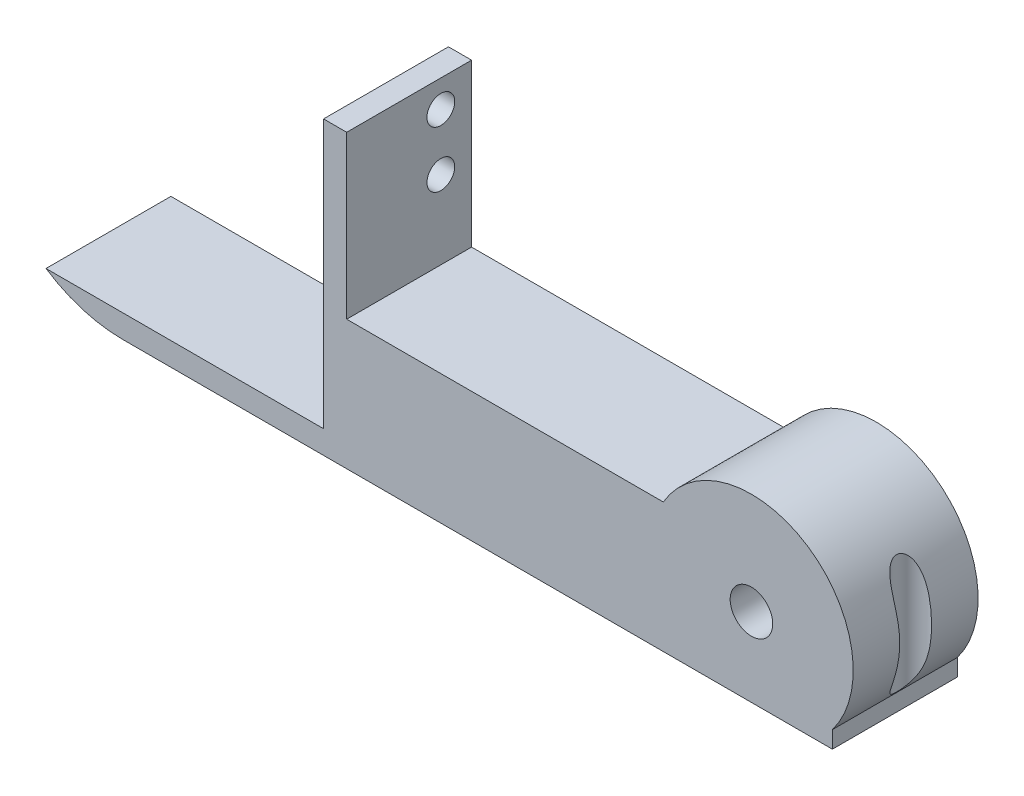
ISO-10303-21;
HEADER;
FILE_DESCRIPTION(('STEP AP214'),'2;1');
FILE_NAME('part.step','',(''),(''),'','','');
FILE_SCHEMA(('AUTOMOTIVE_DESIGN { 1 0 10303 214 1 1 1 1 }'));
ENDSEC;
DATA;
#1=APPLICATION_CONTEXT('core data for automotive mechanical design processes');
#2=APPLICATION_PROTOCOL_DEFINITION('international standard','automotive_design',2000,#1);
#3=PRODUCT_CONTEXT('',#1,'mechanical');
#4=PRODUCT('Part','Part','',(#3));
#5=PRODUCT_RELATED_PRODUCT_CATEGORY('part','',(#4));
#6=PRODUCT_DEFINITION_FORMATION('','',#4);
#7=PRODUCT_DEFINITION_CONTEXT('part definition',#1,'design');
#8=PRODUCT_DEFINITION('design','',#6,#7);
#9=PRODUCT_DEFINITION_SHAPE('','',#8);
#10=(LENGTH_UNIT() NAMED_UNIT(*) SI_UNIT(.MILLI.,.METRE.));
#11=(NAMED_UNIT(*) PLANE_ANGLE_UNIT() SI_UNIT($,.RADIAN.));
#12=(NAMED_UNIT(*) SI_UNIT($,.STERADIAN.) SOLID_ANGLE_UNIT());
#13=UNCERTAINTY_MEASURE_WITH_UNIT(LENGTH_MEASURE(1.E-05),#10,'distance_accuracy_value','');
#14=(GEOMETRIC_REPRESENTATION_CONTEXT(3) GLOBAL_UNCERTAINTY_ASSIGNED_CONTEXT((#13)) GLOBAL_UNIT_ASSIGNED_CONTEXT((#10,
#11,#12)) REPRESENTATION_CONTEXT('',''));
#15=CARTESIAN_POINT('',(0.,0.,0.));
#16=DIRECTION('',(0.,0.,1.));
#17=DIRECTION('',(1.,0.,0.));
#18=AXIS2_PLACEMENT_3D('',#15,#16,#17);
#19=CARTESIAN_POINT('',(-85.,14.,27.));
#20=DIRECTION('',(0.,-1.,0.));
#21=DIRECTION('',(0.,0.,-1.));
#22=AXIS2_PLACEMENT_3D('',#19,#20,#21);
#23=PLANE('',#22);
#24=DIRECTION('',(-1.,0.,0.));
#25=VECTOR('',#24,1.);
#26=CARTESIAN_POINT('',(-85.,14.,0.));
#27=LINE('',#26,#25);
#28=CARTESIAN_POINT('',(48.4474411167424,14.,0.));
#29=VERTEX_POINT('',#28);
#30=CARTESIAN_POINT('',(-20.,14.,0.));
#31=VERTEX_POINT('',#30);
#32=EDGE_CURVE('E135',#29,#31,#27,.T.);
#33=ORIENTED_EDGE('',*,*,#32,.T.);
#34=DIRECTION('',(0.,0.,1.));
#35=VECTOR('',#34,1.);
#36=CARTESIAN_POINT('',(-20.,14.,0.));
#37=LINE('',#36,#35);
#38=CARTESIAN_POINT('',(-20.,14.,27.));
#39=VERTEX_POINT('',#38);
#40=EDGE_CURVE('E116',#31,#39,#37,.T.);
#41=ORIENTED_EDGE('',*,*,#40,.T.);
#42=DIRECTION('',(-1.,0.,0.));
#43=VECTOR('',#42,1.);
#44=CARTESIAN_POINT('',(-85.,14.,27.));
#45=LINE('',#44,#43);
#46=CARTESIAN_POINT('',(48.4474411167424,14.,27.));
#47=VERTEX_POINT('',#46);
#48=EDGE_CURVE('E159',#47,#39,#45,.T.);
#49=ORIENTED_EDGE('',*,*,#48,.F.);
#50=DIRECTION('',(0.,0.,-1.));
#51=VECTOR('',#50,1.);
#52=CARTESIAN_POINT('',(48.4474411167424,14.,27.));
#53=LINE('',#52,#51);
#54=EDGE_CURVE('E143',#47,#29,#53,.T.);
#55=ORIENTED_EDGE('',*,*,#54,.T.);
#56=EDGE_LOOP('',(#33,#41,#49,#55));
#57=FACE_BOUND('',#56,.T.);
#58=ADVANCED_FACE('F39',(#57),#23,.F.);
#59=CARTESIAN_POINT('',(-85.,-14.,27.));
#60=DIRECTION('',(0.,1.,0.));
#61=DIRECTION('',(0.,0.,1.));
#62=AXIS2_PLACEMENT_3D('',#59,#60,#61);
#63=PLANE('',#62);
#64=DIRECTION('',(1.,0.,0.));
#65=VECTOR('',#64,1.);
#66=CARTESIAN_POINT('',(-85.,-14.,27.));
#67=LINE('',#66,#65);
#68=CARTESIAN_POINT('',(-68.416876048223,-14.,27.));
#69=VERTEX_POINT('',#68);
#70=CARTESIAN_POINT('',(85.,-14.,27.));
#71=VERTEX_POINT('',#70);
#72=EDGE_CURVE('E145',#69,#71,#67,.T.);
#73=ORIENTED_EDGE('',*,*,#72,.F.);
#74=DIRECTION('',(0.,0.,-1.));
#75=VECTOR('',#74,1.);
#76=CARTESIAN_POINT('',(-68.416876048223,-14.,27.));
#77=LINE('',#76,#75);
#78=CARTESIAN_POINT('',(-68.416876048223,-14.,0.));
#79=VERTEX_POINT('',#78);
#80=EDGE_CURVE('E167',#69,#79,#77,.T.);
#81=ORIENTED_EDGE('',*,*,#80,.T.);
#82=DIRECTION('',(1.,0.,0.));
#83=VECTOR('',#82,1.);
#84=CARTESIAN_POINT('',(-85.,-14.,0.));
#85=LINE('',#84,#83);
#86=CARTESIAN_POINT('',(85.,-14.,0.));
#87=VERTEX_POINT('',#86);
#88=EDGE_CURVE('E172',#79,#87,#85,.T.);
#89=ORIENTED_EDGE('',*,*,#88,.T.);
#90=DIRECTION('',(0.,0.,-1.));
#91=VECTOR('',#90,1.);
#92=CARTESIAN_POINT('',(85.,-14.,27.));
#93=LINE('',#92,#91);
#94=EDGE_CURVE('E163',#71,#87,#93,.T.);
#95=ORIENTED_EDGE('',*,*,#94,.F.);
#96=EDGE_LOOP('',(#73,#81,#89,#95));
#97=FACE_BOUND('',#96,.T.);
#98=ADVANCED_FACE('F227',(#97),#63,.F.);
#99=CARTESIAN_POINT('',(85.,-10.3322916259734,27.));
#100=DIRECTION('',(-1.,0.,0.));
#101=DIRECTION('',(0.,0.,1.));
#102=AXIS2_PLACEMENT_3D('',#99,#100,#101);
#103=PLANE('',#102);
#104=DIRECTION('',(0.,1.,0.));
#105=VECTOR('',#104,1.);
#106=CARTESIAN_POINT('',(85.,-10.3322916259734,0.));
#107=LINE('',#106,#105);
#108=CARTESIAN_POINT('',(85.,-10.3322916259734,0.));
#109=VERTEX_POINT('',#108);
#110=EDGE_CURVE('E152',#87,#109,#107,.T.);
#111=ORIENTED_EDGE('',*,*,#110,.T.);
#112=DIRECTION('',(0.,0.,-1.));
#113=VECTOR('',#112,1.);
#114=CARTESIAN_POINT('',(85.,-10.3322916259734,27.));
#115=LINE('',#114,#113);
#116=CARTESIAN_POINT('',(85.,-10.3322916259734,27.));
#117=VERTEX_POINT('',#116);
#118=EDGE_CURVE('E158',#117,#109,#115,.T.);
#119=ORIENTED_EDGE('',*,*,#118,.F.);
#120=DIRECTION('',(0.,1.,0.));
#121=VECTOR('',#120,1.);
#122=CARTESIAN_POINT('',(85.,-10.3322916259734,27.));
#123=LINE('',#122,#121);
#124=EDGE_CURVE('E150',#71,#117,#123,.T.);
#125=ORIENTED_EDGE('',*,*,#124,.F.);
#126=ORIENTED_EDGE('',*,*,#94,.T.);
#127=EDGE_LOOP('',(#111,#119,#125,#126));
#128=FACE_BOUND('',#127,.T.);
#129=ADVANCED_FACE('F218',(#128),#103,.F.);
#130=CARTESIAN_POINT('',(67.5,2.99999999999998,27.));
#131=DIRECTION('',(0.,0.,-1.));
#132=DIRECTION('',(-1.,0.,0.));
#133=AXIS2_PLACEMENT_3D('',#130,#131,#132);
#134=CYLINDRICAL_SURFACE('',#133,22.);
#135=CARTESIAN_POINT('',(88.8554286649109,8.28636609949595,9.99999999999999));
#136=CARTESIAN_POINT('',(88.9267523223163,7.99823947215683,10.0000034892413));
#137=CARTESIAN_POINT('',(88.9922400474223,7.70868422527333,10.0021662650663));
#138=CARTESIAN_POINT('',(89.1114464805297,7.12716365142973,10.0088649109779));
#139=CARTESIAN_POINT('',(89.1651642554422,6.83519813529277,10.0134009691153));
#140=CARTESIAN_POINT('',(89.2607580063223,6.24924084943452,10.0232175145108));
#141=CARTESIAN_POINT('',(89.3026296627402,5.9552483805332,10.0284982722659));
#142=CARTESIAN_POINT('',(89.3744394839582,5.36580703683181,10.0385056419885));
#143=CARTESIAN_POINT('',(89.4043779670178,5.07035820108603,10.0432322687323));
#144=CARTESIAN_POINT('',(89.4522656770547,4.47855829344689,10.0511776969796));
#145=CARTESIAN_POINT('',(89.4702184987558,4.18220751887261,10.0543969504859));
#146=CARTESIAN_POINT('',(89.4941171316591,3.5890046582049,10.0587465713666));
#147=CARTESIAN_POINT('',(89.5000628913134,3.29215256996475,10.059876929773));
#148=CARTESIAN_POINT('',(89.4999361233733,2.69853535971539,10.0598531833435));
#149=CARTESIAN_POINT('',(89.4938670076787,2.40177023694514,10.0586997270491));
#150=CARTESIAN_POINT('',(89.4697286751442,1.80874530174135,10.0543091578474));
#151=CARTESIAN_POINT('',(89.4516594760146,1.5124854885627,10.0510720480154));
#152=CARTESIAN_POINT('',(89.4034951005986,0.920244185000205,10.0430910142356));
#153=CARTESIAN_POINT('',(89.3733709039436,0.624265106519803,10.0383434598424));
#154=CARTESIAN_POINT('',(89.3011467515979,0.0337776158675502,10.0283053463441));
#155=CARTESIAN_POINT('',(89.2590466300296,-0.260730775876442,10.0230147797185));
#156=CARTESIAN_POINT('',(89.1628963208944,-0.84805747729797,10.0131962199909));
#157=CARTESIAN_POINT('',(89.1088361662171,-1.14087416708255,10.0086688685056));
#158=CARTESIAN_POINT('',(88.9888704884697,-1.72409515642655,10.0020287628696));
#159=CARTESIAN_POINT('',(88.9229652949151,-2.01449952285901,9.99991594156129));
#160=CARTESIAN_POINT('',(88.7795528342887,-2.59186393238318,10.0000890249395));
#161=CARTESIAN_POINT('',(88.7020674092624,-2.87882938405179,10.0023667426362));
#162=CARTESIAN_POINT('',(88.5355543454294,-3.44932167382697,10.0136481419539));
#163=CARTESIAN_POINT('',(88.4465251432221,-3.73284804047218,10.0226527353993));
#164=CARTESIAN_POINT('',(88.2573585743069,-4.29519826469604,10.0501541710559));
#165=CARTESIAN_POINT('',(88.1572402189095,-4.5740292545614,10.0686349588063));
#166=CARTESIAN_POINT('',(87.9462561937944,-5.12637146374682,10.1184074699377));
#167=CARTESIAN_POINT('',(87.8353951343991,-5.39988490516058,10.1496937161694));
#168=CARTESIAN_POINT('',(87.630428048671,-5.8778964892392,10.2200250456097));
#169=CARTESIAN_POINT('',(87.5383516313651,-6.08376821481047,10.2556184581789));
#170=CARTESIAN_POINT('',(87.3488782577679,-6.49064676266944,10.339139307125));
#171=CARTESIAN_POINT('',(87.2514795774538,-6.69165197777273,10.3870707590022));
#172=CARTESIAN_POINT('',(87.0528485994588,-7.0863607598393,10.4977383719199));
#173=CARTESIAN_POINT('',(86.9516375030071,-7.2800953654754,10.5604005904176));
#174=CARTESIAN_POINT('',(86.7465349386689,-7.65913694859001,10.7038902138213));
#175=CARTESIAN_POINT('',(86.642646276378,-7.84445222690212,10.7846992385625));
#176=CARTESIAN_POINT('',(86.4467919597504,-8.18269639588151,10.9576633569645));
#177=CARTESIAN_POINT('',(86.3548555176496,-8.33687587399781,11.0473797090856));
#178=CARTESIAN_POINT('',(86.1732419146758,-8.63358129995789,11.2474104214533));
#179=CARTESIAN_POINT('',(86.083568668193,-8.77608790231295,11.3577580188478));
#180=CARTESIAN_POINT('',(85.9535489095205,-8.97802684861951,11.5417336005406));
#181=CARTESIAN_POINT('',(85.910675055085,-9.0437849667722,11.6066523279043));
#182=CARTESIAN_POINT('',(85.8274313183875,-9.17008585338759,11.7428345541672));
#183=CARTESIAN_POINT('',(85.7870618843346,-9.23062768905652,11.8140991832484));
#184=CARTESIAN_POINT('',(85.6712866440718,-9.40254857098492,12.0374163756361));
#185=CARTESIAN_POINT('',(85.6007688038603,-9.50490726685341,12.1995919273721));
#186=CARTESIAN_POINT('',(85.504909090294,-9.64228837293542,12.4816741057632));
#187=CARTESIAN_POINT('',(85.4726034656102,-9.68809262688357,12.5940319846008));
#188=CARTESIAN_POINT('',(85.4187858928798,-9.76398331895657,12.8264564892039));
#189=CARTESIAN_POINT('',(85.397266146606,-9.79408111355598,12.9465174745463));
#190=CARTESIAN_POINT('',(85.3667978966454,-9.83659822788039,13.1920515233871));
#191=CARTESIAN_POINT('',(85.3579206526344,-9.8489173429406,13.3175511883866));
#192=CARTESIAN_POINT('',(85.3538528402985,-9.85456946308735,13.5691993145));
#193=CARTESIAN_POINT('',(85.3586598948487,-9.84790576571324,13.6953476591306));
#194=CARTESIAN_POINT('',(85.3805481380089,-9.81742137028605,13.9340961610995));
#195=CARTESIAN_POINT('',(85.3966227802735,-9.79500728822042,14.0469759249814));
#196=CARTESIAN_POINT('',(85.4386629410385,-9.73599929741043,14.2669932798538));
#197=CARTESIAN_POINT('',(85.4646319724544,-9.69940035237619,14.3741288159786));
#198=CARTESIAN_POINT('',(85.5349253562373,-9.59945648422487,14.6157870958604));
#199=CARTESIAN_POINT('',(85.5824864666392,-9.53125395724552,14.7473565287485));
#200=CARTESIAN_POINT('',(85.6880360589343,-9.37756367727986,14.9952859851576));
#201=CARTESIAN_POINT('',(85.7460443863205,-9.29204298763454,15.1116163211826));
#202=CARTESIAN_POINT('',(85.8974585812248,-9.06480760491734,15.3798912886769));
#203=CARTESIAN_POINT('',(85.9947636991635,-8.9154767626713,15.5231736788753));
#204=CARTESIAN_POINT('',(86.1453381457839,-8.67734517696579,15.7163222931778));
#205=CARTESIAN_POINT('',(86.1963738458496,-8.5954874494445,15.7771458799042));
#206=CARTESIAN_POINT('',(86.299354264947,-8.4277697800661,15.8921610527914));
#207=CARTESIAN_POINT('',(86.3512988183732,-8.34191056268845,15.9463538330839));
#208=CARTESIAN_POINT('',(86.4931783404284,-8.10359969615461,16.0856595112162));
#209=CARTESIAN_POINT('',(86.5834402921785,-7.94786291679026,16.1648159243593));
#210=CARTESIAN_POINT('',(86.7628962915785,-7.6289410800881,16.3079309769267));
#211=CARTESIAN_POINT('',(86.8520894852905,-7.4657505107316,16.3718781450203));
#212=CARTESIAN_POINT('',(87.0281811226923,-7.13338921828416,16.4870129942965));
#213=CARTESIAN_POINT('',(87.1150753582591,-6.96420869776984,16.5381785535326));
#214=CARTESIAN_POINT('',(87.2854981419918,-6.621367827982,16.629642858445));
#215=CARTESIAN_POINT('',(87.3690273616594,-6.44770838395353,16.669943781429));
#216=CARTESIAN_POINT('',(87.5326327768357,-6.09568719485474,16.7416403743585));
#217=CARTESIAN_POINT('',(87.6126855028742,-5.91730363874211,16.7729817012967));
#218=CARTESIAN_POINT('',(87.7684155743561,-5.55744030203236,16.8279451883583));
#219=CARTESIAN_POINT('',(87.8440920134127,-5.37595989004386,16.8515657540897));
#220=CARTESIAN_POINT('',(87.9908300530076,-5.01028860875333,16.8923846383284));
#221=CARTESIAN_POINT('',(88.0618883044279,-4.8260958886376,16.9095783380629));
#222=CARTESIAN_POINT('',(88.1991498251082,-4.45548558964435,16.9386348802995));
#223=CARTESIAN_POINT('',(88.2653525134488,-4.26906774764554,16.9504970858099));
#224=CARTESIAN_POINT('',(88.456782784233,-3.70601352413829,16.9796318628517));
#225=CARTESIAN_POINT('',(88.5744804238885,-3.32645330851578,16.9903648132961));
#226=CARTESIAN_POINT('',(88.7891324698283,-2.56153653679028,17.0010171198538));
#227=CARTESIAN_POINT('',(88.886091046887,-2.17618116285115,17.0009386522725));
#228=CARTESIAN_POINT('',(89.0395902267964,-1.48786706453837,16.9957920688877));
#229=CARTESIAN_POINT('',(89.1003181975969,-1.18582445088103,16.9918476485667));
#230=CARTESIAN_POINT('',(89.2090399309906,-0.579450720670883,16.9825194765011));
#231=CARTESIAN_POINT('',(89.2570326814931,-0.275119424207571,16.9771356104293));
#232=CARTESIAN_POINT('',(89.3402107308648,0.335391580733063,16.9665175860151));
#233=CARTESIAN_POINT('',(89.3753918236528,0.641571862757807,16.9612834773569));
#234=CARTESIAN_POINT('',(89.4328623223536,1.25515277734928,16.9521614112665));
#235=CARTESIAN_POINT('',(89.4551521058186,1.56255337391071,16.9482734144116));
#236=CARTESIAN_POINT('',(89.4867877432226,2.17781781732384,16.9426217255611));
#237=CARTESIAN_POINT('',(89.4961429357495,2.48568116913627,16.9408565010745));
#238=CARTESIAN_POINT('',(89.501920799124,3.10153852367529,16.939775713456));
#239=CARTESIAN_POINT('',(89.4983432845719,3.40953252821159,16.9404601854423));
#240=CARTESIAN_POINT('',(89.4782654088615,4.02500148327313,16.9441511678733));
#241=CARTESIAN_POINT('',(89.461768468599,4.33247654961114,16.9471570636323));
#242=CARTESIAN_POINT('',(89.4158881099675,4.94643381416384,16.9549136049404));
#243=CARTESIAN_POINT('',(89.3865051173275,5.25291604484284,16.9596641928476));
#244=CARTESIAN_POINT('',(89.3216479143631,5.80679870315563,16.9689324695527));
#245=CARTESIAN_POINT('',(89.2883616626116,6.05446010925292,16.9733256490231));
#246=CARTESIAN_POINT('',(89.2133714501568,6.54851014552822,16.9818533922454));
#247=CARTESIAN_POINT('',(89.1716675724365,6.79489878822886,16.9859879585462));
#248=CARTESIAN_POINT('',(89.0798716828867,7.28621202976593,16.9930995932267));
#249=CARTESIAN_POINT('',(89.0297768521236,7.53113610784799,16.9960762714947));
#250=CARTESIAN_POINT('',(88.921264793278,8.01915297547238,16.9998019074476));
#251=CARTESIAN_POINT('',(88.8628476131536,8.26224577555907,17.0005508779694));
#252=CARTESIAN_POINT('',(88.7377639374752,8.74629161650318,16.9985809159154));
#253=CARTESIAN_POINT('',(88.6710974478611,8.98724465890117,16.9958619858367));
#254=CARTESIAN_POINT('',(88.5296227807014,9.46663875918156,16.9855247057778));
#255=CARTESIAN_POINT('',(88.4548150420495,9.70507995171809,16.9779066198018));
#256=CARTESIAN_POINT('',(88.2972776438549,10.1788228281593,16.9561232588109));
#257=CARTESIAN_POINT('',(88.2145546552749,10.4141269686694,16.9419634592719));
#258=CARTESIAN_POINT('',(88.0413984211602,10.8811774010476,16.9051712416253));
#259=CARTESIAN_POINT('',(87.9509668279546,11.1129244428703,16.8825406357148));
#260=CARTESIAN_POINT('',(87.762460203331,11.5729036744613,16.8264289089644));
#261=CARTESIAN_POINT('',(87.6643607684686,11.8011216232858,16.7929119773906));
#262=CARTESIAN_POINT('',(87.461390676979,12.2522456782146,16.7122573191736));
#263=CARTESIAN_POINT('',(87.3565175385768,12.4751497959958,16.6651145780201));
#264=CARTESIAN_POINT('',(87.141686884677,12.9127807075208,16.5541186220498));
#265=CARTESIAN_POINT('',(87.0317595912582,13.1275448875386,16.4903562101139));
#266=CARTESIAN_POINT('',(86.8081622873875,13.5475722554334,16.3419553980172));
#267=CARTESIAN_POINT('',(86.6944970562833,13.7528468258444,16.2573428215574));
#268=CARTESIAN_POINT('',(86.4911332438819,14.1071641944354,16.0833872124376));
#269=CARTESIAN_POINT('',(86.401591490877,14.2587363622982,15.9990635195417));
#270=CARTESIAN_POINT('',(86.2241813027616,14.5513759031607,15.8115409442311));
#271=CARTESIAN_POINT('',(86.136315177901,14.6924294575044,15.7083178270505));
#272=CARTESIAN_POINT('',(85.9649811224651,14.9611921514367,15.4789041757632));
#273=CARTESIAN_POINT('',(85.8815716192026,15.0887389544935,15.3524754045138));
#274=CARTESIAN_POINT('',(85.725875488673,15.322217942826,15.0751162587936));
#275=CARTESIAN_POINT('',(85.653557096232,15.4282121504801,14.9242585011929));
#276=CARTESIAN_POINT('',(85.5493864744488,15.5787515688721,14.654633241489));
#277=CARTESIAN_POINT('',(85.5121797389312,15.6318824280304,14.542739930605));
#278=CARTESIAN_POINT('',(85.4482915630194,15.7224959659908,14.3099037306716));
#279=CARTESIAN_POINT('',(85.4216023715102,15.7599901697318,14.1889675844196));
#280=CARTESIAN_POINT('',(85.3808710878504,15.8170091616339,13.9398516114576));
#281=CARTESIAN_POINT('',(85.3669203400972,15.8364041862689,13.8116263642418));
#282=CARTESIAN_POINT('',(85.3534384260041,15.8551502549342,13.5529691007761));
#283=CARTESIAN_POINT('',(85.3539011237657,15.8545098281872,13.4225380471865));
#284=CARTESIAN_POINT('',(85.3683901342228,15.8343577333476,13.1773274794792));
#285=CARTESIAN_POINT('',(85.3810398615244,15.8167612931018,13.0622992092268));
#286=CARTESIAN_POINT('',(85.4168533718833,15.7666481760045,12.8372793198659));
#287=CARTESIAN_POINT('',(85.4400205971881,15.7341266143068,12.7272893627201));
#288=CARTESIAN_POINT('',(85.5028534271077,15.645194974073,12.4851665532829));
#289=CARTESIAN_POINT('',(85.5453050783819,15.5846733764797,12.3552727708181));
#290=CARTESIAN_POINT('',(85.6408694330318,15.446522646703,12.1092757101002));
#291=CARTESIAN_POINT('',(85.6940003219199,15.3688643102461,11.9931965007134));
#292=CARTESIAN_POINT('',(85.8321343900616,15.1636309399754,11.7277676597445));
#293=CARTESIAN_POINT('',(85.9209539469855,15.0290301286431,11.585883926005));
#294=CARTESIAN_POINT('',(86.1058588562209,14.7410168698226,11.3285759372449));
#295=CARTESIAN_POINT('',(86.2019588486509,14.5875661105871,11.2132069848687));
#296=CARTESIAN_POINT('',(86.3811781360044,14.2927452738339,11.0216065049556));
#297=CARTESIAN_POINT('',(86.4639627677294,14.1532690476519,10.9420734833681));
#298=CARTESIAN_POINT('',(86.6293829164247,13.8671082108582,10.796882303112));
#299=CARTESIAN_POINT('',(86.7120182850201,13.7204185323371,10.7312340761296));
#300=CARTESIAN_POINT('',(86.8759265990267,13.4212585483163,10.6117708758104));
#301=CARTESIAN_POINT('',(86.9571969524197,13.2687787207087,10.5579764805055));
#302=CARTESIAN_POINT('',(87.1173382099702,12.9594367675776,10.4606222542072));
#303=CARTESIAN_POINT('',(87.1962095616394,12.8025754699803,10.4170605040887));
#304=CARTESIAN_POINT('',(87.3566369585215,12.473640437866,10.3357794855603));
#305=CARTESIAN_POINT('',(87.437966217901,12.3012942608549,10.2987222573639));
#306=CARTESIAN_POINT('',(87.5966922332988,11.9531880025371,10.2330508170876));
#307=CARTESIAN_POINT('',(87.6740879708868,11.7774270532277,10.2044387824319));
#308=CARTESIAN_POINT('',(87.8246484550574,11.4229318953109,10.1542871594827));
#309=CARTESIAN_POINT('',(87.8978093566085,11.2441951686776,10.1327539179134));
#310=CARTESIAN_POINT('',(88.0395969549904,10.8843126508675,10.0956235672833));
#311=CARTESIAN_POINT('',(88.1082230190035,10.7031665276885,10.080027285261));
#312=CARTESIAN_POINT('',(88.3074451057006,10.1555136756193,10.0404976734571));
#313=CARTESIAN_POINT('',(88.4309303192641,9.78586184665276,10.0239614360665));
#314=CARTESIAN_POINT('',(88.6581018285243,9.04041480757193,10.0037123030082));
#315=CARTESIAN_POINT('',(88.7617942721892,8.66462154459348,9.99999541928993));
#316=CARTESIAN_POINT('',(88.8554286649109,8.28636609949595,9.99999999999999));
#317=B_SPLINE_CURVE_WITH_KNOTS('',3,(#135,#136,#137,#138,#139,#140,#141,#142,#143,#144,#145,
#146,#147,#148,#149,#150,#151,#152,#153,#154,#155,#156,#157,#158,#159,#160,#161,#162,#163,#164,
#165,#166,#167,#168,#169,#170,#171,#172,#173,#174,#175,#176,#177,#178,#179,#180,#181,#182,#183,
#184,#185,#186,#187,#188,#189,#190,#191,#192,#193,#194,#195,#196,#197,#198,#199,#200,#201,#202,
#203,#204,#205,#206,#207,#208,#209,#210,#211,#212,#213,#214,#215,#216,#217,#218,#219,#220,#221,
#222,#223,#224,#225,#226,#227,#228,#229,#230,#231,#232,#233,#234,#235,#236,#237,#238,#239,#240,
#241,#242,#243,#244,#245,#246,#247,#248,#249,#250,#251,#252,#253,#254,#255,#256,#257,#258,#259,
#260,#261,#262,#263,#264,#265,#266,#267,#268,#269,#270,#271,#272,#273,#274,#275,#276,#277,#278,
#279,#280,#281,#282,#283,#284,#285,#286,#287,#288,#289,#290,#291,#292,#293,#294,#295,#296,#297,
#298,#299,#300,#301,#302,#303,#304,#305,#306,#307,#308,#309,#310,#311,#312,#313,#314,#315,#316),
.UNSPECIFIED.,.T.,.F.,(4,2,2,2,2,2,2,2,2,2,2,2,2,2,2,2,2,2,2,2,2,2,2,2,2,2,2,2,2,2,2,2,2,2,2,2,
2,2,2,2,2,2,2,2,2,2,2,2,2,2,2,2,2,2,2,2,2,2,2,2,2,2,2,2,2,2,2,2,2,2,2,2,2,2,2,2,2,2,2,2,2,2,2,2,
2,2,2,2,2,2,4),(0.,0.890381920583592,1.78083440265076,2.67161116063512,3.56236415988693,
4.45284988552283,5.34333943412507,6.23357614404564,7.12381154011581,8.01620304510395,
8.90860691113571,9.80175729846697,10.6948828432072,11.5863445975146,12.4779272109204,
13.3680042816242,14.2577010458344,14.9422820925099,15.6270862231452,16.3085236670184,
16.989273998859,17.590262815335,18.1922283064691,18.4974903516954,18.8028068721336,
19.4104404109667,19.7857335186124,20.1607548952162,20.5378818315571,20.9149432604772,
21.262017579756,21.6092152397054,22.0735386634991,22.5387536004558,23.2207374343239,
23.5626888886738,23.9045786705869,24.493536474569,25.0829370918256,25.6733508627347,
26.2636462247472,26.8574494410015,27.4513752044797,28.0457269855415,28.6401497592131,
29.8318356613141,31.0232816810274,31.9473512900392,32.8714943145381,33.7959404632513,
34.7203595360119,35.6441108424174,36.5678753915268,37.4913954224777,38.4148849445017,
39.1645269979641,39.9141616616375,40.6640486714152,41.4139313600943,42.1638135088291,
42.9136552515243,43.6628705035445,44.4119255641643,45.1634700404908,45.9152914498193,
46.6630883216503,47.4099636338516,47.9946137520853,48.5800188866674,49.1718093521679,
49.7618719253494,50.1484491108843,50.5347408654191,50.9237813583794,51.3126562365123,
51.6621995035076,52.0118572542704,52.4577654082141,52.9044394255025,53.5452413519738,
54.1873679275079,54.7285365127543,55.2700908922709,55.8125781204788,56.3549635242253,
56.9370939707495,57.5193743771088,58.1021754311873,58.685057641735,59.8543234935628,
61.0232255585592),.UNSPECIFIED.);
#318=CARTESIAN_POINT('',(88.8554286649109,8.28636609949595,9.99999999999999));
#319=VERTEX_POINT('',#318);
#320=EDGE_CURVE('E43',#319,#319,#317,.T.);
#321=ORIENTED_EDGE('',*,*,#320,.T.);
#322=EDGE_LOOP('',(#321));
#323=FACE_BOUND('',#322,.T.);
#324=CARTESIAN_POINT('',(67.5,2.99999999999998,0.));
#325=DIRECTION('',(0.,0.,1.));
#326=DIRECTION('',(1.,0.,0.));
#327=AXIS2_PLACEMENT_3D('',#324,#325,#326);
#328=CIRCLE('',#327,22.);
#329=EDGE_CURVE('E146',#109,#29,#328,.T.);
#330=ORIENTED_EDGE('',*,*,#329,.T.);
#331=ORIENTED_EDGE('',*,*,#54,.F.);
#332=CARTESIAN_POINT('',(67.5,2.99999999999998,27.));
#333=DIRECTION('',(0.,0.,1.));
#334=DIRECTION('',(1.,0.,0.));
#335=AXIS2_PLACEMENT_3D('',#332,#333,#334);
#336=CIRCLE('',#335,22.);
#337=EDGE_CURVE('E209',#117,#47,#336,.T.);
#338=ORIENTED_EDGE('',*,*,#337,.F.);
#339=ORIENTED_EDGE('',*,*,#118,.T.);
#340=EDGE_LOOP('',(#330,#331,#338,#339));
#341=FACE_BOUND('',#340,.T.);
#342=ADVANCED_FACE('F223',(#323,#341),#134,.T.);
#343=CARTESIAN_POINT('',(67.5,2.99999999999998,27.));
#344=DIRECTION('',(0.,0.,1.));
#345=DIRECTION('',(1.,0.,0.));
#346=AXIS2_PLACEMENT_3D('',#343,#344,#345);
#347=PLANE('',#346);
#348=DIRECTION('',(-1.,0.,0.));
#349=VECTOR('',#348,1.);
#350=CARTESIAN_POINT('',(-25.,-8.99999999999999,27.));
#351=LINE('',#350,#349);
#352=CARTESIAN_POINT('',(-25.,-8.99999999999999,27.));
#353=VERTEX_POINT('',#352);
#354=CARTESIAN_POINT('',(-85.,-8.99999999999999,27.));
#355=VERTEX_POINT('',#354);
#356=EDGE_CURVE('E188',#353,#355,#351,.T.);
#357=ORIENTED_EDGE('',*,*,#356,.T.);
#358=CARTESIAN_POINT('',(-68.416876048223,16.,27.));
#359=DIRECTION('',(0.,0.,1.));
#360=DIRECTION('',(1.,0.,0.));
#361=AXIS2_PLACEMENT_3D('',#358,#359,#360);
#362=CIRCLE('',#361,30.);
#363=EDGE_CURVE('E11',#355,#69,#362,.T.);
#364=ORIENTED_EDGE('',*,*,#363,.T.);
#365=ORIENTED_EDGE('',*,*,#72,.T.);
#366=ORIENTED_EDGE('',*,*,#124,.T.);
#367=ORIENTED_EDGE('',*,*,#337,.T.);
#368=ORIENTED_EDGE('',*,*,#48,.T.);
#369=DIRECTION('',(0.,1.,0.));
#370=VECTOR('',#369,1.);
#371=CARTESIAN_POINT('',(-20.,14.,27.));
#372=LINE('',#371,#370);
#373=CARTESIAN_POINT('',(-20.,49.,27.));
#374=VERTEX_POINT('',#373);
#375=EDGE_CURVE('E123',#39,#374,#372,.T.);
#376=ORIENTED_EDGE('',*,*,#375,.T.);
#377=DIRECTION('',(-1.,0.,0.));
#378=VECTOR('',#377,1.);
#379=CARTESIAN_POINT('',(-20.,49.,27.));
#380=LINE('',#379,#378);
#381=CARTESIAN_POINT('',(-25.,49.,27.));
#382=VERTEX_POINT('',#381);
#383=EDGE_CURVE('E197',#374,#382,#380,.T.);
#384=ORIENTED_EDGE('',*,*,#383,.T.);
#385=DIRECTION('',(0.,1.,0.));
#386=VECTOR('',#385,1.);
#387=CARTESIAN_POINT('',(-25.,14.,27.));
#388=LINE('',#387,#386);
#389=EDGE_CURVE('E189',#353,#382,#388,.T.);
#390=ORIENTED_EDGE('',*,*,#389,.F.);
#391=EDGE_LOOP('',(#357,#364,#365,#366,#367,#368,#376,#384,#390));
#392=FACE_BOUND('',#391,.T.);
#393=CARTESIAN_POINT('',(67.5,2.99999999999998,27.));
#394=DIRECTION('',(0.,0.,1.));
#395=DIRECTION('',(1.,0.,0.));
#396=AXIS2_PLACEMENT_3D('',#393,#394,#395);
#397=CIRCLE('',#396,4.6);
#398=CARTESIAN_POINT('',(72.1,2.99999999999998,27.));
#399=VERTEX_POINT('',#398);
#400=EDGE_CURVE('E173',#399,#399,#397,.T.);
#401=ORIENTED_EDGE('',*,*,#400,.F.);
#402=EDGE_LOOP('',(#401));
#403=FACE_BOUND('',#402,.T.);
#404=ADVANCED_FACE('F224',(#392,#403),#347,.T.);
#405=CARTESIAN_POINT('',(67.5,2.99999999999998,0.));
#406=DIRECTION('',(0.,0.,1.));
#407=DIRECTION('',(1.,0.,0.));
#408=AXIS2_PLACEMENT_3D('',#405,#406,#407);
#409=PLANE('',#408);
#410=CARTESIAN_POINT('',(67.5,2.99999999999998,0.));
#411=DIRECTION('',(0.,0.,1.));
#412=DIRECTION('',(1.,0.,0.));
#413=AXIS2_PLACEMENT_3D('',#410,#411,#412);
#414=CIRCLE('',#413,4.6);
#415=CARTESIAN_POINT('',(72.1,2.99999999999998,0.));
#416=VERTEX_POINT('',#415);
#417=EDGE_CURVE('E168',#416,#416,#414,.T.);
#418=ORIENTED_EDGE('',*,*,#417,.T.);
#419=EDGE_LOOP('',(#418));
#420=FACE_BOUND('',#419,.T.);
#421=ORIENTED_EDGE('',*,*,#88,.F.);
#422=CARTESIAN_POINT('',(-68.416876048223,16.,0.));
#423=DIRECTION('',(0.,0.,1.));
#424=DIRECTION('',(1.,0.,0.));
#425=AXIS2_PLACEMENT_3D('',#422,#423,#424);
#426=CIRCLE('',#425,30.);
#427=CARTESIAN_POINT('',(-85.,-9.,0.));
#428=VERTEX_POINT('',#427);
#429=EDGE_CURVE('E54',#79,#428,#426,.F.);
#430=ORIENTED_EDGE('',*,*,#429,.T.);
#431=DIRECTION('',(-1.,0.,0.));
#432=VECTOR('',#431,1.);
#433=CARTESIAN_POINT('',(-25.,-9.,0.));
#434=LINE('',#433,#432);
#435=CARTESIAN_POINT('',(-25.,-9.,0.));
#436=VERTEX_POINT('',#435);
#437=EDGE_CURVE('E179',#436,#428,#434,.T.);
#438=ORIENTED_EDGE('',*,*,#437,.F.);
#439=DIRECTION('',(0.,-1.,0.));
#440=VECTOR('',#439,1.);
#441=CARTESIAN_POINT('',(-25.,-9.,0.));
#442=LINE('',#441,#440);
#443=CARTESIAN_POINT('',(-25.,49.,0.));
#444=VERTEX_POINT('',#443);
#445=EDGE_CURVE('E192',#444,#436,#442,.T.);
#446=ORIENTED_EDGE('',*,*,#445,.F.);
#447=DIRECTION('',(-1.,0.,0.));
#448=VECTOR('',#447,1.);
#449=CARTESIAN_POINT('',(-20.,49.,0.));
#450=LINE('',#449,#448);
#451=CARTESIAN_POINT('',(-20.,49.,0.));
#452=VERTEX_POINT('',#451);
#453=EDGE_CURVE('E137',#452,#444,#450,.T.);
#454=ORIENTED_EDGE('',*,*,#453,.F.);
#455=DIRECTION('',(0.,-1.,0.));
#456=VECTOR('',#455,1.);
#457=CARTESIAN_POINT('',(-20.,14.,0.));
#458=LINE('',#457,#456);
#459=EDGE_CURVE('E120',#452,#31,#458,.T.);
#460=ORIENTED_EDGE('',*,*,#459,.T.);
#461=ORIENTED_EDGE('',*,*,#32,.F.);
#462=ORIENTED_EDGE('',*,*,#329,.F.);
#463=ORIENTED_EDGE('',*,*,#110,.F.);
#464=EDGE_LOOP('',(#421,#430,#438,#446,#454,#460,#461,#462,#463));
#465=FACE_BOUND('',#464,.T.);
#466=ADVANCED_FACE('F133',(#420,#465),#409,.F.);
#467=CARTESIAN_POINT('',(67.5,2.99999999999998,-8.));
#468=DIRECTION('',(0.,0.,1.));
#469=DIRECTION('',(1.,0.,0.));
#470=AXIS2_PLACEMENT_3D('',#467,#468,#469);
#471=CYLINDRICAL_SURFACE('',#470,4.6);
#472=ORIENTED_EDGE('',*,*,#400,.T.);
#473=EDGE_LOOP('',(#472));
#474=FACE_BOUND('',#473,.T.);
#475=ORIENTED_EDGE('',*,*,#417,.F.);
#476=EDGE_LOOP('',(#475));
#477=FACE_BOUND('',#476,.T.);
#478=ADVANCED_FACE('F241',(#474,#477),#471,.F.);
#479=CARTESIAN_POINT('',(-25.,-8.99999999999999,27.));
#480=DIRECTION('',(0.,-1.,0.));
#481=DIRECTION('',(0.,0.,-1.));
#482=AXIS2_PLACEMENT_3D('',#479,#480,#481);
#483=PLANE('',#482);
#484=DIRECTION('',(0.,0.,1.));
#485=VECTOR('',#484,1.);
#486=CARTESIAN_POINT('',(-85.,-8.99999999999999,27.));
#487=LINE('',#486,#485);
#488=EDGE_CURVE('E184',#428,#355,#487,.T.);
#489=ORIENTED_EDGE('',*,*,#488,.T.);
#490=ORIENTED_EDGE('',*,*,#356,.F.);
#491=DIRECTION('',(0.,0.,1.));
#492=VECTOR('',#491,1.);
#493=CARTESIAN_POINT('',(-25.,-9.,5.));
#494=LINE('',#493,#492);
#495=EDGE_CURVE('E185',#436,#353,#494,.T.);
#496=ORIENTED_EDGE('',*,*,#495,.F.);
#497=ORIENTED_EDGE('',*,*,#437,.T.);
#498=EDGE_LOOP('',(#489,#490,#496,#497));
#499=FACE_BOUND('',#498,.T.);
#500=ADVANCED_FACE('F182',(#499),#483,.F.);
#501=CARTESIAN_POINT('',(-25.,0.,0.));
#502=DIRECTION('',(-1.,0.,0.));
#503=DIRECTION('',(0.,0.,1.));
#504=AXIS2_PLACEMENT_3D('',#501,#502,#503);
#505=PLANE('',#504);
#506=CARTESIAN_POINT('',(-25.,43.0919253411843,6.64658399116764));
#507=DIRECTION('',(-1.,0.,0.));
#508=DIRECTION('',(0.,0.,1.));
#509=AXIS2_PLACEMENT_3D('',#506,#507,#508);
#510=CIRCLE('',#509,3.);
#511=CARTESIAN_POINT('',(-25.,43.0919253411843,9.64658399116765));
#512=VERTEX_POINT('',#511);
#513=EDGE_CURVE('E293',#512,#512,#510,.T.);
#514=ORIENTED_EDGE('',*,*,#513,.F.);
#515=EDGE_LOOP('',(#514));
#516=FACE_BOUND('',#515,.T.);
#517=CARTESIAN_POINT('',(-25.,30.9080746588157,6.64658399116764));
#518=DIRECTION('',(-1.,0.,0.));
#519=DIRECTION('',(0.,0.,1.));
#520=AXIS2_PLACEMENT_3D('',#517,#518,#519);
#521=CIRCLE('',#520,3.);
#522=CARTESIAN_POINT('',(-25.,30.9080746588157,9.64658399116765));
#523=VERTEX_POINT('',#522);
#524=EDGE_CURVE('E287',#523,#523,#521,.T.);
#525=ORIENTED_EDGE('',*,*,#524,.F.);
#526=EDGE_LOOP('',(#525));
#527=FACE_BOUND('',#526,.T.);
#528=ORIENTED_EDGE('',*,*,#445,.T.);
#529=ORIENTED_EDGE('',*,*,#495,.T.);
#530=ORIENTED_EDGE('',*,*,#389,.T.);
#531=DIRECTION('',(0.,0.,-1.));
#532=VECTOR('',#531,1.);
#533=CARTESIAN_POINT('',(-25.,49.,0.));
#534=LINE('',#533,#532);
#535=EDGE_CURVE('E139',#382,#444,#534,.T.);
#536=ORIENTED_EDGE('',*,*,#535,.T.);
#537=EDGE_LOOP('',(#528,#529,#530,#536));
#538=FACE_BOUND('',#537,.T.);
#539=ADVANCED_FACE('F250',(#516,#527,#538),#505,.T.);
#540=CARTESIAN_POINT('',(-20.,49.,0.));
#541=DIRECTION('',(0.,1.,0.));
#542=DIRECTION('',(0.,0.,1.));
#543=AXIS2_PLACEMENT_3D('',#540,#541,#542);
#544=PLANE('',#543);
#545=ORIENTED_EDGE('',*,*,#535,.F.);
#546=ORIENTED_EDGE('',*,*,#383,.F.);
#547=DIRECTION('',(0.,0.,-1.));
#548=VECTOR('',#547,1.);
#549=CARTESIAN_POINT('',(-20.,49.,0.));
#550=LINE('',#549,#548);
#551=EDGE_CURVE('E299',#374,#452,#550,.T.);
#552=ORIENTED_EDGE('',*,*,#551,.T.);
#553=ORIENTED_EDGE('',*,*,#453,.T.);
#554=EDGE_LOOP('',(#545,#546,#552,#553));
#555=FACE_BOUND('',#554,.T.);
#556=ADVANCED_FACE('F253',(#555),#544,.T.);
#557=CARTESIAN_POINT('',(-20.,0.,0.));
#558=DIRECTION('',(1.,0.,0.));
#559=DIRECTION('',(0.,0.,-1.));
#560=AXIS2_PLACEMENT_3D('',#557,#558,#559);
#561=PLANE('',#560);
#562=CARTESIAN_POINT('',(-20.,43.0919253411843,6.64658399116764));
#563=DIRECTION('',(1.,0.,0.));
#564=DIRECTION('',(0.,0.,-1.));
#565=AXIS2_PLACEMENT_3D('',#562,#563,#564);
#566=CIRCLE('',#565,3.);
#567=CARTESIAN_POINT('',(-20.,43.0919253411843,3.64658399116764));
#568=VERTEX_POINT('',#567);
#569=EDGE_CURVE('E281',#568,#568,#566,.T.);
#570=ORIENTED_EDGE('',*,*,#569,.F.);
#571=EDGE_LOOP('',(#570));
#572=FACE_BOUND('',#571,.T.);
#573=CARTESIAN_POINT('',(-20.,30.9080746588157,6.64658399116764));
#574=DIRECTION('',(1.,0.,0.));
#575=DIRECTION('',(0.,0.,1.));
#576=AXIS2_PLACEMENT_3D('',#573,#574,#575);
#577=CIRCLE('',#576,3.);
#578=CARTESIAN_POINT('',(-20.,30.9080746588157,9.64658399116765));
#579=VERTEX_POINT('',#578);
#580=EDGE_CURVE('E278',#579,#579,#577,.T.);
#581=ORIENTED_EDGE('',*,*,#580,.F.);
#582=EDGE_LOOP('',(#581));
#583=FACE_BOUND('',#582,.T.);
#584=ORIENTED_EDGE('',*,*,#459,.F.);
#585=ORIENTED_EDGE('',*,*,#551,.F.);
#586=ORIENTED_EDGE('',*,*,#375,.F.);
#587=ORIENTED_EDGE('',*,*,#40,.F.);
#588=EDGE_LOOP('',(#584,#585,#586,#587));
#589=FACE_BOUND('',#588,.T.);
#590=ADVANCED_FACE('F118',(#572,#583,#589),#561,.T.);
#591=CARTESIAN_POINT('',(-85.,30.9080746588157,6.64658399116764));
#592=DIRECTION('',(1.,0.,0.));
#593=DIRECTION('',(0.,0.,-1.));
#594=AXIS2_PLACEMENT_3D('',#591,#592,#593);
#595=CYLINDRICAL_SURFACE('',#594,3.);
#596=ORIENTED_EDGE('',*,*,#524,.T.);
#597=EDGE_LOOP('',(#596));
#598=FACE_BOUND('',#597,.T.);
#599=ORIENTED_EDGE('',*,*,#580,.T.);
#600=EDGE_LOOP('',(#599));
#601=FACE_BOUND('',#600,.T.);
#602=ADVANCED_FACE('F260',(#598,#601),#595,.F.);
#603=CARTESIAN_POINT('',(-85.,43.0919253411843,6.64658399116764));
#604=DIRECTION('',(1.,0.,0.));
#605=DIRECTION('',(0.,0.,-1.));
#606=AXIS2_PLACEMENT_3D('',#603,#604,#605);
#607=CYLINDRICAL_SURFACE('',#606,3.);
#608=ORIENTED_EDGE('',*,*,#513,.T.);
#609=EDGE_LOOP('',(#608));
#610=FACE_BOUND('',#609,.T.);
#611=ORIENTED_EDGE('',*,*,#569,.T.);
#612=EDGE_LOOP('',(#611));
#613=FACE_BOUND('',#612,.T.);
#614=ADVANCED_FACE('F264',(#610,#613),#607,.F.);
#615=CARTESIAN_POINT('',(-68.416876048223,16.,27.));
#616=DIRECTION('',(0.,0.,-1.));
#617=DIRECTION('',(-1.,0.,0.));
#618=AXIS2_PLACEMENT_3D('',#615,#616,#617);
#619=CYLINDRICAL_SURFACE('',#618,30.);
#620=ORIENTED_EDGE('',*,*,#363,.F.);
#621=ORIENTED_EDGE('',*,*,#488,.F.);
#622=ORIENTED_EDGE('',*,*,#429,.F.);
#623=ORIENTED_EDGE('',*,*,#80,.F.);
#624=EDGE_LOOP('',(#620,#621,#622,#623));
#625=FACE_BOUND('',#624,.T.);
#626=ADVANCED_FACE('F41',(#625),#619,.T.);
#627=CARTESIAN_POINT('',(88.8554286649109,49.,13.5));
#628=DIRECTION('',(0.,-1.,0.));
#629=DIRECTION('',(0.,0.,-1.));
#630=AXIS2_PLACEMENT_3D('',#627,#628,#629);
#631=CYLINDRICAL_SURFACE('',#630,3.50000000000001);
#632=ORIENTED_EDGE('',*,*,#320,.F.);
#633=EDGE_LOOP('',(#632));
#634=FACE_BOUND('',#633,.T.);
#635=ADVANCED_FACE('F268',(#634),#631,.F.);
#636=CLOSED_SHELL('',(#58,#98,#129,#342,#404,#466,#478,#500,#539,#556,#590,#602,#614,#626,#635));
#637=MANIFOLD_SOLID_BREP('B2',#636);
#638=ADVANCED_BREP_SHAPE_REPRESENTATION('',(#18,#637),#14);
#639=SHAPE_DEFINITION_REPRESENTATION(#9,#638);
ENDSEC;
END-ISO-10303-21;
